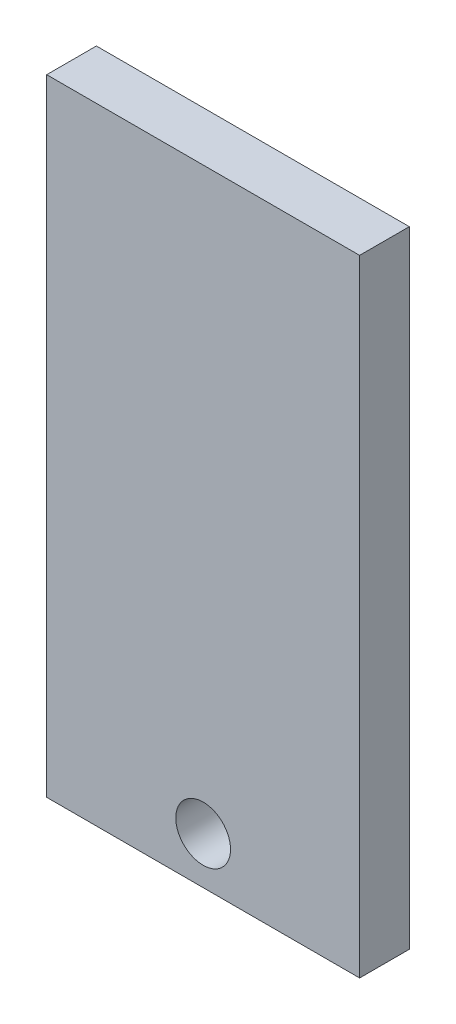
ISO-10303-21;
HEADER;
FILE_DESCRIPTION(('STEP AP214'),'2;1');
FILE_NAME('part.step','',(''),(''),'','','');
FILE_SCHEMA(('AUTOMOTIVE_DESIGN { 1 0 10303 214 1 1 1 1 }'));
ENDSEC;
DATA;
#1=APPLICATION_CONTEXT('core data for automotive mechanical design processes');
#2=APPLICATION_PROTOCOL_DEFINITION('international standard','automotive_design',2000,#1);
#3=PRODUCT_CONTEXT('',#1,'mechanical');
#4=PRODUCT('Part','Part','',(#3));
#5=PRODUCT_RELATED_PRODUCT_CATEGORY('part','',(#4));
#6=PRODUCT_DEFINITION_FORMATION('','',#4);
#7=PRODUCT_DEFINITION_CONTEXT('part definition',#1,'design');
#8=PRODUCT_DEFINITION('design','',#6,#7);
#9=PRODUCT_DEFINITION_SHAPE('','',#8);
#10=(LENGTH_UNIT() NAMED_UNIT(*) SI_UNIT(.MILLI.,.METRE.));
#11=(NAMED_UNIT(*) PLANE_ANGLE_UNIT() SI_UNIT($,.RADIAN.));
#12=(NAMED_UNIT(*) SI_UNIT($,.STERADIAN.) SOLID_ANGLE_UNIT());
#13=UNCERTAINTY_MEASURE_WITH_UNIT(LENGTH_MEASURE(1.E-05),#10,'distance_accuracy_value','');
#14=(GEOMETRIC_REPRESENTATION_CONTEXT(3) GLOBAL_UNCERTAINTY_ASSIGNED_CONTEXT((#13)) GLOBAL_UNIT_ASSIGNED_CONTEXT((#10,
#11,#12)) REPRESENTATION_CONTEXT('',''));
#15=CARTESIAN_POINT('',(0.,0.,0.));
#16=DIRECTION('',(0.,0.,1.));
#17=DIRECTION('',(1.,0.,0.));
#18=AXIS2_PLACEMENT_3D('',#15,#16,#17);
#19=CARTESIAN_POINT('',(20.,40.,6.35));
#20=DIRECTION('',(-1.,0.,0.));
#21=DIRECTION('',(0.,-1.,0.));
#22=AXIS2_PLACEMENT_3D('',#19,#20,#21);
#23=PLANE('',#22);
#24=DIRECTION('',(0.,1.,0.));
#25=VECTOR('',#24,1.);
#26=CARTESIAN_POINT('',(20.,40.,0.));
#27=LINE('',#26,#25);
#28=CARTESIAN_POINT('',(20.,-40.,0.));
#29=VERTEX_POINT('',#28);
#30=CARTESIAN_POINT('',(20.,40.,0.));
#31=VERTEX_POINT('',#30);
#32=EDGE_CURVE('E96',#29,#31,#27,.T.);
#33=ORIENTED_EDGE('',*,*,#32,.T.);
#34=DIRECTION('',(0.,0.,-1.));
#35=VECTOR('',#34,1.);
#36=CARTESIAN_POINT('',(20.,40.,6.35));
#37=LINE('',#36,#35);
#38=CARTESIAN_POINT('',(20.,40.,6.35));
#39=VERTEX_POINT('',#38);
#40=EDGE_CURVE('E11',#39,#31,#37,.T.);
#41=ORIENTED_EDGE('',*,*,#40,.F.);
#42=DIRECTION('',(0.,1.,0.));
#43=VECTOR('',#42,1.);
#44=CARTESIAN_POINT('',(20.,40.,6.35));
#45=LINE('',#44,#43);
#46=CARTESIAN_POINT('',(20.,-40.,6.35));
#47=VERTEX_POINT('',#46);
#48=EDGE_CURVE('E84',#47,#39,#45,.T.);
#49=ORIENTED_EDGE('',*,*,#48,.F.);
#50=DIRECTION('',(0.,0.,-1.));
#51=VECTOR('',#50,1.);
#52=CARTESIAN_POINT('',(20.,-40.,6.35));
#53=LINE('',#52,#51);
#54=EDGE_CURVE('E92',#47,#29,#53,.T.);
#55=ORIENTED_EDGE('',*,*,#54,.T.);
#56=EDGE_LOOP('',(#33,#41,#49,#55));
#57=FACE_BOUND('',#56,.T.);
#58=ADVANCED_FACE('F33',(#57),#23,.F.);
#59=CARTESIAN_POINT('',(-20.,40.,6.35));
#60=DIRECTION('',(0.,-1.,0.));
#61=DIRECTION('',(0.,0.,-1.));
#62=AXIS2_PLACEMENT_3D('',#59,#60,#61);
#63=PLANE('',#62);
#64=DIRECTION('',(-1.,0.,0.));
#65=VECTOR('',#64,1.);
#66=CARTESIAN_POINT('',(-20.,40.,0.));
#67=LINE('',#66,#65);
#68=CARTESIAN_POINT('',(-20.,40.,0.));
#69=VERTEX_POINT('',#68);
#70=EDGE_CURVE('E88',#31,#69,#67,.T.);
#71=ORIENTED_EDGE('',*,*,#70,.T.);
#72=DIRECTION('',(0.,0.,-1.));
#73=VECTOR('',#72,1.);
#74=CARTESIAN_POINT('',(-20.,40.,6.35));
#75=LINE('',#74,#73);
#76=CARTESIAN_POINT('',(-20.,40.,6.35));
#77=VERTEX_POINT('',#76);
#78=EDGE_CURVE('E41',#77,#69,#75,.T.);
#79=ORIENTED_EDGE('',*,*,#78,.F.);
#80=DIRECTION('',(-1.,0.,0.));
#81=VECTOR('',#80,1.);
#82=CARTESIAN_POINT('',(-20.,40.,6.35));
#83=LINE('',#82,#81);
#84=EDGE_CURVE('E79',#39,#77,#83,.T.);
#85=ORIENTED_EDGE('',*,*,#84,.F.);
#86=ORIENTED_EDGE('',*,*,#40,.T.);
#87=EDGE_LOOP('',(#71,#79,#85,#86));
#88=FACE_BOUND('',#87,.T.);
#89=ADVANCED_FACE('F87',(#88),#63,.F.);
#90=CARTESIAN_POINT('',(-20.,40.,6.35));
#91=DIRECTION('',(1.,0.,0.));
#92=DIRECTION('',(0.,1.,0.));
#93=AXIS2_PLACEMENT_3D('',#90,#91,#92);
#94=PLANE('',#93);
#95=DIRECTION('',(0.,-1.,0.));
#96=VECTOR('',#95,1.);
#97=CARTESIAN_POINT('',(-20.,40.,0.));
#98=LINE('',#97,#96);
#99=CARTESIAN_POINT('',(-20.,-40.,0.));
#100=VERTEX_POINT('',#99);
#101=EDGE_CURVE('E66',#69,#100,#98,.T.);
#102=ORIENTED_EDGE('',*,*,#101,.T.);
#103=DIRECTION('',(0.,0.,-1.));
#104=VECTOR('',#103,1.);
#105=CARTESIAN_POINT('',(-20.,-40.,6.35));
#106=LINE('',#105,#104);
#107=CARTESIAN_POINT('',(-20.,-40.,6.35));
#108=VERTEX_POINT('',#107);
#109=EDGE_CURVE('E89',#108,#100,#106,.T.);
#110=ORIENTED_EDGE('',*,*,#109,.F.);
#111=DIRECTION('',(0.,-1.,0.));
#112=VECTOR('',#111,1.);
#113=CARTESIAN_POINT('',(-20.,40.,6.35));
#114=LINE('',#113,#112);
#115=EDGE_CURVE('E82',#77,#108,#114,.T.);
#116=ORIENTED_EDGE('',*,*,#115,.F.);
#117=ORIENTED_EDGE('',*,*,#78,.T.);
#118=EDGE_LOOP('',(#102,#110,#116,#117));
#119=FACE_BOUND('',#118,.T.);
#120=ADVANCED_FACE('F90',(#119),#94,.F.);
#121=CARTESIAN_POINT('',(-20.,-40.,6.35));
#122=DIRECTION('',(0.,1.,0.));
#123=DIRECTION('',(0.,0.,1.));
#124=AXIS2_PLACEMENT_3D('',#121,#122,#123);
#125=PLANE('',#124);
#126=DIRECTION('',(1.,0.,0.));
#127=VECTOR('',#126,1.);
#128=CARTESIAN_POINT('',(-20.,-40.,0.));
#129=LINE('',#128,#127);
#130=EDGE_CURVE('E72',#100,#29,#129,.T.);
#131=ORIENTED_EDGE('',*,*,#130,.T.);
#132=ORIENTED_EDGE('',*,*,#54,.F.);
#133=DIRECTION('',(1.,0.,0.));
#134=VECTOR('',#133,1.);
#135=CARTESIAN_POINT('',(-20.,-40.,6.35));
#136=LINE('',#135,#134);
#137=EDGE_CURVE('E49',#108,#47,#136,.T.);
#138=ORIENTED_EDGE('',*,*,#137,.F.);
#139=ORIENTED_EDGE('',*,*,#109,.T.);
#140=EDGE_LOOP('',(#131,#132,#138,#139));
#141=FACE_BOUND('',#140,.T.);
#142=ADVANCED_FACE('F104',(#141),#125,.F.);
#143=CARTESIAN_POINT('',(0.,0.,6.35));
#144=DIRECTION('',(0.,0.,1.));
#145=DIRECTION('',(1.,0.,0.));
#146=AXIS2_PLACEMENT_3D('',#143,#144,#145);
#147=PLANE('',#146);
#148=CARTESIAN_POINT('',(0.,-34.0194597200458,6.35));
#149=DIRECTION('',(0.,0.,1.));
#150=DIRECTION('',(1.,0.,0.));
#151=AXIS2_PLACEMENT_3D('',#148,#149,#150);
#152=CIRCLE('',#151,3.5);
#153=CARTESIAN_POINT('',(3.5,-34.0194597200458,6.35));
#154=VERTEX_POINT('',#153);
#155=EDGE_CURVE('E112',#154,#154,#152,.T.);
#156=ORIENTED_EDGE('',*,*,#155,.F.);
#157=EDGE_LOOP('',(#156));
#158=FACE_BOUND('',#157,.T.);
#159=ORIENTED_EDGE('',*,*,#48,.T.);
#160=ORIENTED_EDGE('',*,*,#84,.T.);
#161=ORIENTED_EDGE('',*,*,#115,.T.);
#162=ORIENTED_EDGE('',*,*,#137,.T.);
#163=EDGE_LOOP('',(#159,#160,#161,#162));
#164=FACE_BOUND('',#163,.T.);
#165=ADVANCED_FACE('F80',(#158,#164),#147,.T.);
#166=CARTESIAN_POINT('',(0.,0.,0.));
#167=DIRECTION('',(0.,0.,1.));
#168=DIRECTION('',(1.,0.,0.));
#169=AXIS2_PLACEMENT_3D('',#166,#167,#168);
#170=PLANE('',#169);
#171=CARTESIAN_POINT('',(0.,-34.0194597200458,0.));
#172=DIRECTION('',(0.,0.,1.));
#173=DIRECTION('',(1.,0.,0.));
#174=AXIS2_PLACEMENT_3D('',#171,#172,#173);
#175=CIRCLE('',#174,3.5);
#176=CARTESIAN_POINT('',(3.5,-34.0194597200458,0.));
#177=VERTEX_POINT('',#176);
#178=EDGE_CURVE('E99',#177,#177,#175,.F.);
#179=ORIENTED_EDGE('',*,*,#178,.F.);
#180=EDGE_LOOP('',(#179));
#181=FACE_BOUND('',#180,.T.);
#182=ORIENTED_EDGE('',*,*,#32,.F.);
#183=ORIENTED_EDGE('',*,*,#130,.F.);
#184=ORIENTED_EDGE('',*,*,#101,.F.);
#185=ORIENTED_EDGE('',*,*,#70,.F.);
#186=EDGE_LOOP('',(#182,#183,#184,#185));
#187=FACE_BOUND('',#186,.T.);
#188=ADVANCED_FACE('F107',(#181,#187),#170,.F.);
#189=CARTESIAN_POINT('',(0.,-34.0194597200458,-0.00100000000000013));
#190=DIRECTION('',(0.,0.,1.));
#191=DIRECTION('',(1.,0.,0.));
#192=AXIS2_PLACEMENT_3D('',#189,#190,#191);
#193=CYLINDRICAL_SURFACE('',#192,3.5);
#194=ORIENTED_EDGE('',*,*,#155,.T.);
#195=EDGE_LOOP('',(#194));
#196=FACE_BOUND('',#195,.T.);
#197=ORIENTED_EDGE('',*,*,#178,.T.);
#198=EDGE_LOOP('',(#197));
#199=FACE_BOUND('',#198,.T.);
#200=ADVANCED_FACE('F116',(#196,#199),#193,.F.);
#201=CLOSED_SHELL('',(#58,#89,#120,#142,#165,#188,#200));
#202=MANIFOLD_SOLID_BREP('B2',#201);
#203=ADVANCED_BREP_SHAPE_REPRESENTATION('',(#18,#202),#14);
#204=SHAPE_DEFINITION_REPRESENTATION(#9,#203);
ENDSEC;
END-ISO-10303-21;
